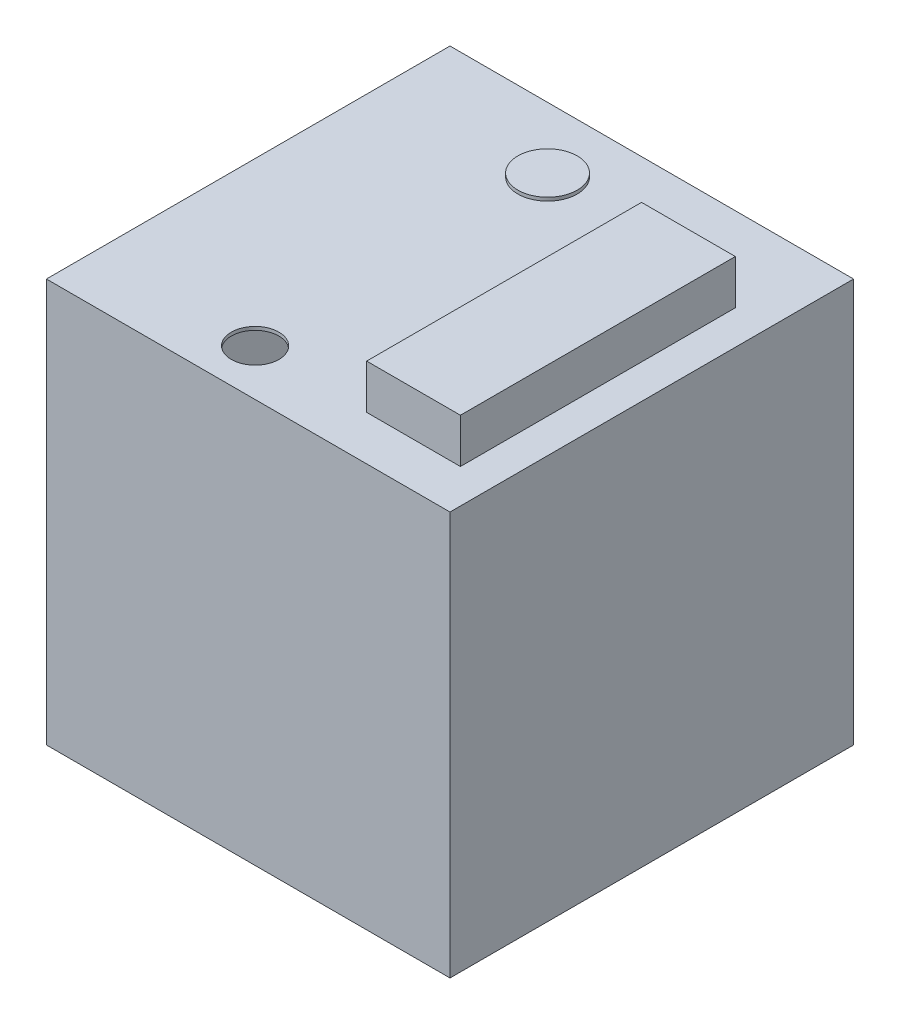
ISO-10303-21;
HEADER;
FILE_DESCRIPTION(('STEP AP214'),'2;1');
FILE_NAME('part.step','',(''),(''),'','','');
FILE_SCHEMA(('AUTOMOTIVE_DESIGN { 1 0 10303 214 1 1 1 1 }'));
ENDSEC;
DATA;
#1=APPLICATION_CONTEXT('core data for automotive mechanical design processes');
#2=APPLICATION_PROTOCOL_DEFINITION('international standard','automotive_design',2000,#1);
#3=PRODUCT_CONTEXT('',#1,'mechanical');
#4=PRODUCT('Part','Part','',(#3));
#5=PRODUCT_RELATED_PRODUCT_CATEGORY('part','',(#4));
#6=PRODUCT_DEFINITION_FORMATION('','',#4);
#7=PRODUCT_DEFINITION_CONTEXT('part definition',#1,'design');
#8=PRODUCT_DEFINITION('design','',#6,#7);
#9=PRODUCT_DEFINITION_SHAPE('','',#8);
#10=(LENGTH_UNIT() NAMED_UNIT(*) SI_UNIT(.MILLI.,.METRE.));
#11=(NAMED_UNIT(*) PLANE_ANGLE_UNIT() SI_UNIT($,.RADIAN.));
#12=(NAMED_UNIT(*) SI_UNIT($,.STERADIAN.) SOLID_ANGLE_UNIT());
#13=UNCERTAINTY_MEASURE_WITH_UNIT(LENGTH_MEASURE(1.E-05),#10,'distance_accuracy_value','');
#14=(GEOMETRIC_REPRESENTATION_CONTEXT(3) GLOBAL_UNCERTAINTY_ASSIGNED_CONTEXT((#13)) GLOBAL_UNIT_ASSIGNED_CONTEXT((#10,
#11,#12)) REPRESENTATION_CONTEXT('',''));
#15=CARTESIAN_POINT('',(0.,0.,0.));
#16=DIRECTION('',(0.,0.,1.));
#17=DIRECTION('',(1.,0.,0.));
#18=AXIS2_PLACEMENT_3D('',#15,#16,#17);
#19=CARTESIAN_POINT('',(0.,300.,0.));
#20=DIRECTION('',(0.,-1.,0.));
#21=DIRECTION('',(0.,0.,-1.));
#22=AXIS2_PLACEMENT_3D('',#19,#20,#21);
#23=PLANE('',#22);
#24=CARTESIAN_POINT('',(120.554438901877,300.,-251.957872919832));
#25=DIRECTION('',(0.,-1.,0.));
#26=DIRECTION('',(0.,0.,-1.));
#27=AXIS2_PLACEMENT_3D('',#24,#25,#26);
#28=CIRCLE('',#27,22.0629985297689);
#29=CARTESIAN_POINT('',(120.554438901877,300.,-274.0208714496));
#30=VERTEX_POINT('',#29);
#31=EDGE_CURVE('E54',#30,#30,#28,.F.);
#32=ORIENTED_EDGE('',*,*,#31,.F.);
#33=EDGE_LOOP('',(#32));
#34=FACE_BOUND('',#33,.T.);
#35=CARTESIAN_POINT('',(120.554438901877,300.,-34.5657529217078));
#36=DIRECTION('',(0.,1.,0.));
#37=DIRECTION('',(0.,0.,1.));
#38=AXIS2_PLACEMENT_3D('',#35,#36,#37);
#39=CIRCLE('',#38,17.6611169685422);
#40=CARTESIAN_POINT('',(120.554438901877,300.,-16.9046359531656));
#41=VERTEX_POINT('',#40);
#42=EDGE_CURVE('E260',#41,#41,#39,.T.);
#43=ORIENTED_EDGE('',*,*,#42,.F.);
#44=EDGE_LOOP('',(#43));
#45=FACE_BOUND('',#44,.T.);
#46=DIRECTION('',(0.,0.,1.));
#47=VECTOR('',#46,1.);
#48=CARTESIAN_POINT('',(0.,300.,0.));
#49=LINE('',#48,#47);
#50=CARTESIAN_POINT('',(0.,300.,-300.));
#51=VERTEX_POINT('',#50);
#52=CARTESIAN_POINT('',(0.,300.,0.));
#53=VERTEX_POINT('',#52);
#54=EDGE_CURVE('E309',#51,#53,#49,.T.);
#55=ORIENTED_EDGE('',*,*,#54,.T.);
#56=DIRECTION('',(1.,0.,0.));
#57=VECTOR('',#56,1.);
#58=CARTESIAN_POINT('',(0.,300.,0.));
#59=LINE('',#58,#57);
#60=CARTESIAN_POINT('',(300.,300.,0.));
#61=VERTEX_POINT('',#60);
#62=EDGE_CURVE('E312',#53,#61,#59,.T.);
#63=ORIENTED_EDGE('',*,*,#62,.T.);
#64=DIRECTION('',(0.,0.,-1.));
#65=VECTOR('',#64,1.);
#66=CARTESIAN_POINT('',(300.,300.,0.));
#67=LINE('',#66,#65);
#68=CARTESIAN_POINT('',(300.,300.,-300.));
#69=VERTEX_POINT('',#68);
#70=EDGE_CURVE('E315',#61,#69,#67,.T.);
#71=ORIENTED_EDGE('',*,*,#70,.T.);
#72=DIRECTION('',(-1.,0.,0.));
#73=VECTOR('',#72,1.);
#74=CARTESIAN_POINT('',(0.,300.,-300.));
#75=LINE('',#74,#73);
#76=EDGE_CURVE('E317',#69,#51,#75,.T.);
#77=ORIENTED_EDGE('',*,*,#76,.T.);
#78=EDGE_LOOP('',(#55,#63,#71,#77));
#79=FACE_BOUND('',#78,.T.);
#80=DIRECTION('',(0.,0.,1.));
#81=VECTOR('',#80,1.);
#82=CARTESIAN_POINT('',(204.884490094855,300.,-237.506276867464));
#83=LINE('',#82,#81);
#84=CARTESIAN_POINT('',(204.884490094855,300.,-237.506276867464));
#85=VERTEX_POINT('',#84);
#86=CARTESIAN_POINT('',(204.884490094855,300.,-33.1587645673039));
#87=VERTEX_POINT('',#86);
#88=EDGE_CURVE('E228',#85,#87,#83,.T.);
#89=ORIENTED_EDGE('',*,*,#88,.F.);
#90=DIRECTION('',(-1.,0.,0.));
#91=VECTOR('',#90,1.);
#92=CARTESIAN_POINT('',(204.884490094855,300.,-237.506276867464));
#93=LINE('',#92,#91);
#94=CARTESIAN_POINT('',(274.588614797324,300.,-237.506276867464));
#95=VERTEX_POINT('',#94);
#96=EDGE_CURVE('E166',#95,#85,#93,.T.);
#97=ORIENTED_EDGE('',*,*,#96,.F.);
#98=DIRECTION('',(0.,0.,-1.));
#99=VECTOR('',#98,1.);
#100=CARTESIAN_POINT('',(274.588614797324,300.,-237.506276867464));
#101=LINE('',#100,#99);
#102=CARTESIAN_POINT('',(274.588614797324,300.,-33.1587645673039));
#103=VERTEX_POINT('',#102);
#104=EDGE_CURVE('E66',#103,#95,#101,.T.);
#105=ORIENTED_EDGE('',*,*,#104,.F.);
#106=DIRECTION('',(1.,0.,0.));
#107=VECTOR('',#106,1.);
#108=CARTESIAN_POINT('',(204.884490094855,300.,-33.1587645673039));
#109=LINE('',#108,#107);
#110=EDGE_CURVE('E61',#87,#103,#109,.T.);
#111=ORIENTED_EDGE('',*,*,#110,.F.);
#112=EDGE_LOOP('',(#89,#97,#105,#111));
#113=FACE_BOUND('',#112,.T.);
#114=ADVANCED_FACE('F45',(#34,#45,#79,#113),#23,.F.);
#115=CARTESIAN_POINT('',(0.,2.54,0.));
#116=DIRECTION('',(0.,-1.,0.));
#117=DIRECTION('',(0.,0.,-1.));
#118=AXIS2_PLACEMENT_3D('',#115,#116,#117);
#119=PLANE('',#118);
#120=DIRECTION('',(0.,0.,1.));
#121=VECTOR('',#120,1.);
#122=CARTESIAN_POINT('',(2.54,2.54,0.));
#123=LINE('',#122,#121);
#124=CARTESIAN_POINT('',(2.54,2.54,-297.46));
#125=VERTEX_POINT('',#124);
#126=CARTESIAN_POINT('',(2.54,2.54,-2.54));
#127=VERTEX_POINT('',#126);
#128=EDGE_CURVE('E288',#125,#127,#123,.T.);
#129=ORIENTED_EDGE('',*,*,#128,.T.);
#130=DIRECTION('',(1.,0.,0.));
#131=VECTOR('',#130,1.);
#132=CARTESIAN_POINT('',(0.,2.54,-2.54));
#133=LINE('',#132,#131);
#134=CARTESIAN_POINT('',(297.46,2.54,-2.54));
#135=VERTEX_POINT('',#134);
#136=EDGE_CURVE('E291',#127,#135,#133,.T.);
#137=ORIENTED_EDGE('',*,*,#136,.T.);
#138=DIRECTION('',(0.,0.,-1.));
#139=VECTOR('',#138,1.);
#140=CARTESIAN_POINT('',(297.46,2.54,0.));
#141=LINE('',#140,#139);
#142=CARTESIAN_POINT('',(297.46,2.54,-297.46));
#143=VERTEX_POINT('',#142);
#144=EDGE_CURVE('E302',#135,#143,#141,.T.);
#145=ORIENTED_EDGE('',*,*,#144,.T.);
#146=DIRECTION('',(-1.,0.,0.));
#147=VECTOR('',#146,1.);
#148=CARTESIAN_POINT('',(0.,2.54,-297.46));
#149=LINE('',#148,#147);
#150=EDGE_CURVE('E299',#143,#125,#149,.T.);
#151=ORIENTED_EDGE('',*,*,#150,.T.);
#152=EDGE_LOOP('',(#129,#137,#145,#151));
#153=FACE_BOUND('',#152,.T.);
#154=ADVANCED_FACE('F346',(#153),#119,.F.);
#155=CARTESIAN_POINT('',(0.,300.,-297.46));
#156=DIRECTION('',(0.,0.,1.));
#157=DIRECTION('',(1.,0.,0.));
#158=AXIS2_PLACEMENT_3D('',#155,#156,#157);
#159=PLANE('',#158);
#160=DIRECTION('',(0.,-1.,0.));
#161=VECTOR('',#160,1.);
#162=CARTESIAN_POINT('',(297.46,300.,-297.46));
#163=LINE('',#162,#161);
#164=CARTESIAN_POINT('',(297.46,297.46,-297.46));
#165=VERTEX_POINT('',#164);
#166=EDGE_CURVE('E298',#165,#143,#163,.T.);
#167=ORIENTED_EDGE('',*,*,#166,.F.);
#168=DIRECTION('',(-1.,0.,0.));
#169=VECTOR('',#168,1.);
#170=CARTESIAN_POINT('',(0.,297.46,-297.46));
#171=LINE('',#170,#169);
#172=CARTESIAN_POINT('',(2.54,297.46,-297.46));
#173=VERTEX_POINT('',#172);
#174=EDGE_CURVE('E337',#165,#173,#171,.T.);
#175=ORIENTED_EDGE('',*,*,#174,.T.);
#176=DIRECTION('',(0.,-1.,0.));
#177=VECTOR('',#176,1.);
#178=CARTESIAN_POINT('',(2.54,300.,-297.46));
#179=LINE('',#178,#177);
#180=EDGE_CURVE('E296',#173,#125,#179,.T.);
#181=ORIENTED_EDGE('',*,*,#180,.T.);
#182=ORIENTED_EDGE('',*,*,#150,.F.);
#183=EDGE_LOOP('',(#167,#175,#181,#182));
#184=FACE_BOUND('',#183,.T.);
#185=ADVANCED_FACE('F426',(#184),#159,.T.);
#186=CARTESIAN_POINT('',(297.46,300.,0.));
#187=DIRECTION('',(-1.,0.,0.));
#188=DIRECTION('',(0.,0.,1.));
#189=AXIS2_PLACEMENT_3D('',#186,#187,#188);
#190=PLANE('',#189);
#191=DIRECTION('',(0.,-1.,0.));
#192=VECTOR('',#191,1.);
#193=CARTESIAN_POINT('',(297.46,300.,-2.54));
#194=LINE('',#193,#192);
#195=CARTESIAN_POINT('',(297.46,297.46,-2.54));
#196=VERTEX_POINT('',#195);
#197=EDGE_CURVE('E295',#196,#135,#194,.T.);
#198=ORIENTED_EDGE('',*,*,#197,.F.);
#199=DIRECTION('',(0.,0.,-1.));
#200=VECTOR('',#199,1.);
#201=CARTESIAN_POINT('',(297.46,297.46,0.));
#202=LINE('',#201,#200);
#203=EDGE_CURVE('E277',#196,#165,#202,.T.);
#204=ORIENTED_EDGE('',*,*,#203,.T.);
#205=ORIENTED_EDGE('',*,*,#166,.T.);
#206=ORIENTED_EDGE('',*,*,#144,.F.);
#207=EDGE_LOOP('',(#198,#204,#205,#206));
#208=FACE_BOUND('',#207,.T.);
#209=ADVANCED_FACE('F422',(#208),#190,.T.);
#210=CARTESIAN_POINT('',(0.,300.,-2.54));
#211=DIRECTION('',(0.,0.,-1.));
#212=DIRECTION('',(-1.,0.,0.));
#213=AXIS2_PLACEMENT_3D('',#210,#211,#212);
#214=PLANE('',#213);
#215=DIRECTION('',(0.,-1.,0.));
#216=VECTOR('',#215,1.);
#217=CARTESIAN_POINT('',(2.54,300.,-2.54));
#218=LINE('',#217,#216);
#219=CARTESIAN_POINT('',(2.54,297.46,-2.54));
#220=VERTEX_POINT('',#219);
#221=EDGE_CURVE('E292',#220,#127,#218,.T.);
#222=ORIENTED_EDGE('',*,*,#221,.F.);
#223=DIRECTION('',(1.,0.,0.));
#224=VECTOR('',#223,1.);
#225=CARTESIAN_POINT('',(0.,297.46,-2.54));
#226=LINE('',#225,#224);
#227=EDGE_CURVE('E282',#220,#196,#226,.T.);
#228=ORIENTED_EDGE('',*,*,#227,.T.);
#229=ORIENTED_EDGE('',*,*,#197,.T.);
#230=ORIENTED_EDGE('',*,*,#136,.F.);
#231=EDGE_LOOP('',(#222,#228,#229,#230));
#232=FACE_BOUND('',#231,.T.);
#233=ADVANCED_FACE('F418',(#232),#214,.T.);
#234=CARTESIAN_POINT('',(2.54,300.,0.));
#235=DIRECTION('',(1.,0.,0.));
#236=DIRECTION('',(0.,0.,-1.));
#237=AXIS2_PLACEMENT_3D('',#234,#235,#236);
#238=PLANE('',#237);
#239=ORIENTED_EDGE('',*,*,#180,.F.);
#240=DIRECTION('',(0.,0.,1.));
#241=VECTOR('',#240,1.);
#242=CARTESIAN_POINT('',(2.54,297.46,0.));
#243=LINE('',#242,#241);
#244=EDGE_CURVE('E285',#173,#220,#243,.T.);
#245=ORIENTED_EDGE('',*,*,#244,.T.);
#246=ORIENTED_EDGE('',*,*,#221,.T.);
#247=ORIENTED_EDGE('',*,*,#128,.F.);
#248=EDGE_LOOP('',(#239,#245,#246,#247));
#249=FACE_BOUND('',#248,.T.);
#250=ADVANCED_FACE('F414',(#249),#238,.T.);
#251=CARTESIAN_POINT('',(0.,297.46,0.));
#252=DIRECTION('',(0.,1.,0.));
#253=DIRECTION('',(0.,0.,1.));
#254=AXIS2_PLACEMENT_3D('',#251,#252,#253);
#255=PLANE('',#254);
#256=CARTESIAN_POINT('',(241.852973126811,297.46,-150.869372117143));
#257=DIRECTION('',(0.,1.,0.));
#258=DIRECTION('',(0.,0.,1.));
#259=AXIS2_PLACEMENT_3D('',#256,#257,#258);
#260=CIRCLE('',#259,19.013382907293);
#261=CARTESIAN_POINT('',(241.852973126811,297.46,-131.85598920985));
#262=VERTEX_POINT('',#261);
#263=EDGE_CURVE('E241',#262,#262,#260,.T.);
#264=ORIENTED_EDGE('',*,*,#263,.T.);
#265=EDGE_LOOP('',(#264));
#266=FACE_BOUND('',#265,.T.);
#267=CARTESIAN_POINT('',(120.554438901877,297.46,-34.5657529217078));
#268=DIRECTION('',(0.,1.,0.));
#269=DIRECTION('',(0.,0.,1.));
#270=AXIS2_PLACEMENT_3D('',#267,#268,#269);
#271=CIRCLE('',#270,17.6611169685422);
#272=CARTESIAN_POINT('',(120.554438901877,297.46,-16.9046359531656));
#273=VERTEX_POINT('',#272);
#274=EDGE_CURVE('E269',#273,#273,#271,.T.);
#275=ORIENTED_EDGE('',*,*,#274,.T.);
#276=EDGE_LOOP('',(#275));
#277=FACE_BOUND('',#276,.T.);
#278=CARTESIAN_POINT('',(120.554438901877,297.46,-251.957872919832));
#279=DIRECTION('',(0.,1.,0.));
#280=DIRECTION('',(0.,0.,1.));
#281=AXIS2_PLACEMENT_3D('',#278,#279,#280);
#282=CIRCLE('',#281,17.1918213135909);
#283=CARTESIAN_POINT('',(120.554438901877,297.46,-234.766051606241));
#284=VERTEX_POINT('',#283);
#285=EDGE_CURVE('E266',#284,#284,#282,.T.);
#286=ORIENTED_EDGE('',*,*,#285,.T.);
#287=EDGE_LOOP('',(#286));
#288=FACE_BOUND('',#287,.T.);
#289=CARTESIAN_POINT('',(241.557939960217,297.46,-206.697112562637));
#290=DIRECTION('',(0.,1.,0.));
#291=DIRECTION('',(0.,0.,1.));
#292=AXIS2_PLACEMENT_3D('',#289,#290,#291);
#293=CIRCLE('',#292,16.2019620569242);
#294=CARTESIAN_POINT('',(241.557939960217,297.46,-190.495150505713));
#295=VERTEX_POINT('',#294);
#296=EDGE_CURVE('E261',#295,#295,#293,.T.);
#297=ORIENTED_EDGE('',*,*,#296,.T.);
#298=EDGE_LOOP('',(#297));
#299=FACE_BOUND('',#298,.T.);
#300=CARTESIAN_POINT('',(241.557939960217,297.46,-57.9435686597378));
#301=DIRECTION('',(0.,1.,0.));
#302=DIRECTION('',(0.,0.,1.));
#303=AXIS2_PLACEMENT_3D('',#300,#301,#302);
#304=CIRCLE('',#303,15.8972712055889);
#305=CARTESIAN_POINT('',(241.557939960217,297.46,-42.0462974541489));
#306=VERTEX_POINT('',#305);
#307=EDGE_CURVE('E274',#306,#306,#304,.T.);
#308=ORIENTED_EDGE('',*,*,#307,.T.);
#309=EDGE_LOOP('',(#308));
#310=FACE_BOUND('',#309,.T.);
#311=ORIENTED_EDGE('',*,*,#244,.F.);
#312=ORIENTED_EDGE('',*,*,#174,.F.);
#313=ORIENTED_EDGE('',*,*,#203,.F.);
#314=ORIENTED_EDGE('',*,*,#227,.F.);
#315=EDGE_LOOP('',(#311,#312,#313,#314));
#316=FACE_BOUND('',#315,.T.);
#317=ADVANCED_FACE('F410',(#266,#277,#288,#299,#310,#316),#255,.F.);
#318=CARTESIAN_POINT('',(241.557939960217,297.46,-57.9435686597378));
#319=DIRECTION('',(0.,1.,0.));
#320=DIRECTION('',(0.,0.,1.));
#321=AXIS2_PLACEMENT_3D('',#318,#319,#320);
#322=CYLINDRICAL_SURFACE('',#321,15.8972712055889);
#323=ORIENTED_EDGE('',*,*,#307,.F.);
#324=EDGE_LOOP('',(#323));
#325=FACE_BOUND('',#324,.T.);
#326=CARTESIAN_POINT('',(241.557939960217,300.,-57.9435686597378));
#327=DIRECTION('',(0.,1.,0.));
#328=DIRECTION('',(0.,0.,1.));
#329=AXIS2_PLACEMENT_3D('',#326,#327,#328);
#330=CIRCLE('',#329,15.8972712055889);
#331=CARTESIAN_POINT('',(241.557939960217,300.,-42.0462974541489));
#332=VERTEX_POINT('',#331);
#333=EDGE_CURVE('E265',#332,#332,#330,.T.);
#334=ORIENTED_EDGE('',*,*,#333,.T.);
#335=EDGE_LOOP('',(#334));
#336=FACE_BOUND('',#335,.T.);
#337=ADVANCED_FACE('F399',(#325,#336),#322,.F.);
#338=CARTESIAN_POINT('',(241.557939960217,297.46,-206.697112562637));
#339=DIRECTION('',(0.,1.,0.));
#340=DIRECTION('',(0.,0.,1.));
#341=AXIS2_PLACEMENT_3D('',#338,#339,#340);
#342=CYLINDRICAL_SURFACE('',#341,16.2019620569242);
#343=ORIENTED_EDGE('',*,*,#296,.F.);
#344=EDGE_LOOP('',(#343));
#345=FACE_BOUND('',#344,.T.);
#346=CARTESIAN_POINT('',(241.557939960217,300.,-206.697112562637));
#347=DIRECTION('',(0.,1.,0.));
#348=DIRECTION('',(0.,0.,1.));
#349=AXIS2_PLACEMENT_3D('',#346,#347,#348);
#350=CIRCLE('',#349,16.2019620569242);
#351=CARTESIAN_POINT('',(241.557939960217,300.,-190.495150505713));
#352=VERTEX_POINT('',#351);
#353=EDGE_CURVE('E250',#352,#352,#350,.F.);
#354=ORIENTED_EDGE('',*,*,#353,.F.);
#355=EDGE_LOOP('',(#354));
#356=FACE_BOUND('',#355,.T.);
#357=ADVANCED_FACE('F395',(#345,#356),#342,.F.);
#358=CARTESIAN_POINT('',(120.554438901877,297.46,-251.957872919832));
#359=DIRECTION('',(0.,1.,0.));
#360=DIRECTION('',(0.,0.,1.));
#361=AXIS2_PLACEMENT_3D('',#358,#359,#360);
#362=CYLINDRICAL_SURFACE('',#361,17.1918213135909);
#363=ORIENTED_EDGE('',*,*,#285,.F.);
#364=EDGE_LOOP('',(#363));
#365=FACE_BOUND('',#364,.T.);
#366=CARTESIAN_POINT('',(120.554438901877,300.,-251.957872919832));
#367=DIRECTION('',(0.,1.,0.));
#368=DIRECTION('',(0.,0.,1.));
#369=AXIS2_PLACEMENT_3D('',#366,#367,#368);
#370=CIRCLE('',#369,17.1918213135909);
#371=CARTESIAN_POINT('',(120.554438901877,300.,-234.766051606241));
#372=VERTEX_POINT('',#371);
#373=EDGE_CURVE('E257',#372,#372,#370,.F.);
#374=ORIENTED_EDGE('',*,*,#373,.F.);
#375=EDGE_LOOP('',(#374));
#376=FACE_BOUND('',#375,.T.);
#377=ADVANCED_FACE('F398',(#365,#376),#362,.F.);
#378=CARTESIAN_POINT('',(120.554438901877,297.46,-34.5657529217078));
#379=DIRECTION('',(0.,1.,0.));
#380=DIRECTION('',(0.,0.,1.));
#381=AXIS2_PLACEMENT_3D('',#378,#379,#380);
#382=CYLINDRICAL_SURFACE('',#381,17.6611169685422);
#383=ORIENTED_EDGE('',*,*,#274,.F.);
#384=EDGE_LOOP('',(#383));
#385=FACE_BOUND('',#384,.T.);
#386=ORIENTED_EDGE('',*,*,#42,.T.);
#387=EDGE_LOOP('',(#386));
#388=FACE_BOUND('',#387,.T.);
#389=ADVANCED_FACE('F403',(#385,#388),#382,.F.);
#390=DIRECTION('',(1.,0.,0.));
#391=VECTOR('',#390,1.);
#392=CARTESIAN_POINT('',(269.743147729685,300.,-38.4081405799748));
#393=LINE('',#392,#391);
#394=CARTESIAN_POINT('',(209.277835101773,300.,-38.4081405799748));
#395=VERTEX_POINT('',#394);
#396=CARTESIAN_POINT('',(269.743147729685,300.,-38.4081405799748));
#397=VERTEX_POINT('',#396);
#398=EDGE_CURVE('E197',#395,#397,#393,.T.);
#399=ORIENTED_EDGE('',*,*,#398,.T.);
#400=DIRECTION('',(0.,0.,-1.));
#401=VECTOR('',#400,1.);
#402=CARTESIAN_POINT('',(269.743147729685,300.,-38.4081405799748));
#403=LINE('',#402,#401);
#404=CARTESIAN_POINT('',(269.743147729685,300.,-230.874289708481));
#405=VERTEX_POINT('',#404);
#406=EDGE_CURVE('E192',#397,#405,#403,.T.);
#407=ORIENTED_EDGE('',*,*,#406,.T.);
#408=DIRECTION('',(-1.,0.,0.));
#409=VECTOR('',#408,1.);
#410=CARTESIAN_POINT('',(269.743147729685,300.,-230.874289708481));
#411=LINE('',#410,#409);
#412=CARTESIAN_POINT('',(209.277835101773,300.,-230.874289708481));
#413=VERTEX_POINT('',#412);
#414=EDGE_CURVE('E210',#405,#413,#411,.T.);
#415=ORIENTED_EDGE('',*,*,#414,.T.);
#416=DIRECTION('',(0.,0.,1.));
#417=VECTOR('',#416,1.);
#418=CARTESIAN_POINT('',(209.277835101773,300.,-38.4081405799748));
#419=LINE('',#418,#417);
#420=EDGE_CURVE('E213',#413,#395,#419,.T.);
#421=ORIENTED_EDGE('',*,*,#420,.T.);
#422=EDGE_LOOP('',(#399,#407,#415,#421));
#423=FACE_BOUND('',#422,.T.);
#424=CARTESIAN_POINT('',(241.852973126811,300.,-150.869372117143));
#425=DIRECTION('',(0.,1.,0.));
#426=DIRECTION('',(0.,0.,1.));
#427=AXIS2_PLACEMENT_3D('',#424,#425,#426);
#428=CIRCLE('',#427,19.013382907293);
#429=CARTESIAN_POINT('',(241.852973126811,300.,-131.85598920985));
#430=VERTEX_POINT('',#429);
#431=EDGE_CURVE('E240',#430,#430,#428,.T.);
#432=ORIENTED_EDGE('',*,*,#431,.F.);
#433=EDGE_LOOP('',(#432));
#434=FACE_BOUND('',#433,.T.);
#435=CARTESIAN_POINT('',(241.557939960217,300.,-206.697112562637));
#436=DIRECTION('',(0.,-1.,0.));
#437=DIRECTION('',(0.,0.,-1.));
#438=AXIS2_PLACEMENT_3D('',#435,#436,#437);
#439=CIRCLE('',#438,19.9460754440356);
#440=CARTESIAN_POINT('',(241.557939960217,300.,-226.643188006672));
#441=VERTEX_POINT('',#440);
#442=EDGE_CURVE('E11',#441,#441,#439,.F.);
#443=ORIENTED_EDGE('',*,*,#442,.F.);
#444=EDGE_LOOP('',(#443));
#445=FACE_BOUND('',#444,.T.);
#446=ORIENTED_EDGE('',*,*,#333,.F.);
#447=EDGE_LOOP('',(#446));
#448=FACE_BOUND('',#447,.T.);
#449=ADVANCED_FACE('F348',(#423,#434,#445,#448),#23,.F.);
#450=CARTESIAN_POINT('',(0.,300.,0.));
#451=DIRECTION('',(1.,0.,0.));
#452=DIRECTION('',(0.,0.,-1.));
#453=AXIS2_PLACEMENT_3D('',#450,#451,#452);
#454=PLANE('',#453);
#455=DIRECTION('',(0.,-1.,0.));
#456=VECTOR('',#455,1.);
#457=CARTESIAN_POINT('',(0.,300.,-300.));
#458=LINE('',#457,#456);
#459=CARTESIAN_POINT('',(0.,0.,-300.));
#460=VERTEX_POINT('',#459);
#461=EDGE_CURVE('E319',#51,#460,#458,.T.);
#462=ORIENTED_EDGE('',*,*,#461,.T.);
#463=DIRECTION('',(0.,0.,1.));
#464=VECTOR('',#463,1.);
#465=CARTESIAN_POINT('',(0.,0.,0.));
#466=LINE('',#465,#464);
#467=CARTESIAN_POINT('',(0.,0.,0.));
#468=VERTEX_POINT('',#467);
#469=EDGE_CURVE('E294',#460,#468,#466,.T.);
#470=ORIENTED_EDGE('',*,*,#469,.T.);
#471=DIRECTION('',(0.,-1.,0.));
#472=VECTOR('',#471,1.);
#473=CARTESIAN_POINT('',(0.,300.,0.));
#474=LINE('',#473,#472);
#475=EDGE_CURVE('E335',#53,#468,#474,.T.);
#476=ORIENTED_EDGE('',*,*,#475,.F.);
#477=ORIENTED_EDGE('',*,*,#54,.F.);
#478=EDGE_LOOP('',(#462,#470,#476,#477));
#479=FACE_BOUND('',#478,.T.);
#480=ADVANCED_FACE('F47',(#479),#454,.F.);
#481=CARTESIAN_POINT('',(0.,300.,0.));
#482=DIRECTION('',(0.,0.,-1.));
#483=DIRECTION('',(-1.,0.,0.));
#484=AXIS2_PLACEMENT_3D('',#481,#482,#483);
#485=PLANE('',#484);
#486=ORIENTED_EDGE('',*,*,#475,.T.);
#487=DIRECTION('',(1.,0.,0.));
#488=VECTOR('',#487,1.);
#489=CARTESIAN_POINT('',(0.,0.,0.));
#490=LINE('',#489,#488);
#491=CARTESIAN_POINT('',(300.,0.,0.));
#492=VERTEX_POINT('',#491);
#493=EDGE_CURVE('E322',#468,#492,#490,.T.);
#494=ORIENTED_EDGE('',*,*,#493,.T.);
#495=DIRECTION('',(0.,-1.,0.));
#496=VECTOR('',#495,1.);
#497=CARTESIAN_POINT('',(300.,300.,0.));
#498=LINE('',#497,#496);
#499=EDGE_CURVE('E333',#61,#492,#498,.T.);
#500=ORIENTED_EDGE('',*,*,#499,.F.);
#501=ORIENTED_EDGE('',*,*,#62,.F.);
#502=EDGE_LOOP('',(#486,#494,#500,#501));
#503=FACE_BOUND('',#502,.T.);
#504=ADVANCED_FACE('F445',(#503),#485,.F.);
#505=CARTESIAN_POINT('',(300.,300.,0.));
#506=DIRECTION('',(-1.,0.,0.));
#507=DIRECTION('',(0.,0.,1.));
#508=AXIS2_PLACEMENT_3D('',#505,#506,#507);
#509=PLANE('',#508);
#510=ORIENTED_EDGE('',*,*,#499,.T.);
#511=DIRECTION('',(0.,0.,-1.));
#512=VECTOR('',#511,1.);
#513=CARTESIAN_POINT('',(300.,0.,0.));
#514=LINE('',#513,#512);
#515=CARTESIAN_POINT('',(300.,0.,-300.));
#516=VERTEX_POINT('',#515);
#517=EDGE_CURVE('E325',#492,#516,#514,.T.);
#518=ORIENTED_EDGE('',*,*,#517,.T.);
#519=DIRECTION('',(0.,-1.,0.));
#520=VECTOR('',#519,1.);
#521=CARTESIAN_POINT('',(300.,300.,-300.));
#522=LINE('',#521,#520);
#523=EDGE_CURVE('E331',#69,#516,#522,.T.);
#524=ORIENTED_EDGE('',*,*,#523,.F.);
#525=ORIENTED_EDGE('',*,*,#70,.F.);
#526=EDGE_LOOP('',(#510,#518,#524,#525));
#527=FACE_BOUND('',#526,.T.);
#528=ADVANCED_FACE('F442',(#527),#509,.F.);
#529=CARTESIAN_POINT('',(0.,300.,-300.));
#530=DIRECTION('',(0.,0.,1.));
#531=DIRECTION('',(1.,0.,0.));
#532=AXIS2_PLACEMENT_3D('',#529,#530,#531);
#533=PLANE('',#532);
#534=ORIENTED_EDGE('',*,*,#523,.T.);
#535=DIRECTION('',(-1.,0.,0.));
#536=VECTOR('',#535,1.);
#537=CARTESIAN_POINT('',(0.,0.,-300.));
#538=LINE('',#537,#536);
#539=EDGE_CURVE('E313',#516,#460,#538,.T.);
#540=ORIENTED_EDGE('',*,*,#539,.T.);
#541=ORIENTED_EDGE('',*,*,#461,.F.);
#542=ORIENTED_EDGE('',*,*,#76,.F.);
#543=EDGE_LOOP('',(#534,#540,#541,#542));
#544=FACE_BOUND('',#543,.T.);
#545=ADVANCED_FACE('F438',(#544),#533,.F.);
#546=CARTESIAN_POINT('',(0.,0.,0.));
#547=DIRECTION('',(0.,-1.,0.));
#548=DIRECTION('',(0.,0.,-1.));
#549=AXIS2_PLACEMENT_3D('',#546,#547,#548);
#550=PLANE('',#549);
#551=ORIENTED_EDGE('',*,*,#469,.F.);
#552=ORIENTED_EDGE('',*,*,#539,.F.);
#553=ORIENTED_EDGE('',*,*,#517,.F.);
#554=ORIENTED_EDGE('',*,*,#493,.F.);
#555=EDGE_LOOP('',(#551,#552,#553,#554));
#556=FACE_BOUND('',#555,.T.);
#557=ADVANCED_FACE('F387',(#556),#550,.T.);
#558=CARTESIAN_POINT('',(120.554438901877,302.54,-251.957872919832));
#559=DIRECTION('',(0.,1.,0.));
#560=DIRECTION('',(0.,0.,1.));
#561=AXIS2_PLACEMENT_3D('',#558,#559,#560);
#562=PLANE('',#561);
#563=CARTESIAN_POINT('',(120.554438901877,302.54,-251.957872919832));
#564=DIRECTION('',(0.,1.,0.));
#565=DIRECTION('',(0.,0.,1.));
#566=AXIS2_PLACEMENT_3D('',#563,#564,#565);
#567=CIRCLE('',#566,22.0629985297689);
#568=CARTESIAN_POINT('',(120.554438901877,302.54,-229.894874390063));
#569=VERTEX_POINT('',#568);
#570=EDGE_CURVE('E254',#569,#569,#567,.T.);
#571=ORIENTED_EDGE('',*,*,#570,.T.);
#572=EDGE_LOOP('',(#571));
#573=FACE_BOUND('',#572,.T.);
#574=ADVANCED_FACE('F384',(#573),#562,.T.);
#575=CARTESIAN_POINT('',(120.554438901877,302.54,-251.957872919832));
#576=DIRECTION('',(0.,-1.,0.));
#577=DIRECTION('',(0.,0.,-1.));
#578=AXIS2_PLACEMENT_3D('',#575,#576,#577);
#579=CYLINDRICAL_SURFACE('',#578,22.0629985297689);
#580=ORIENTED_EDGE('',*,*,#570,.F.);
#581=EDGE_LOOP('',(#580));
#582=FACE_BOUND('',#581,.T.);
#583=ORIENTED_EDGE('',*,*,#31,.T.);
#584=EDGE_LOOP('',(#583));
#585=FACE_BOUND('',#584,.T.);
#586=ADVANCED_FACE('F342',(#582,#585),#579,.T.);
#587=CARTESIAN_POINT('',(120.554438901877,300.,-251.957872919832));
#588=DIRECTION('',(0.,1.,0.));
#589=DIRECTION('',(0.,0.,1.));
#590=AXIS2_PLACEMENT_3D('',#587,#588,#589);
#591=PLANE('',#590);
#592=ORIENTED_EDGE('',*,*,#373,.T.);
#593=EDGE_LOOP('',(#592));
#594=FACE_BOUND('',#593,.T.);
#595=ADVANCED_FACE('F376',(#594),#591,.F.);
#596=CARTESIAN_POINT('',(241.557939960217,302.54,-206.697112562637));
#597=DIRECTION('',(0.,1.,0.));
#598=DIRECTION('',(0.,0.,1.));
#599=AXIS2_PLACEMENT_3D('',#596,#597,#598);
#600=PLANE('',#599);
#601=CARTESIAN_POINT('',(241.557939960217,302.54,-206.697112562637));
#602=DIRECTION('',(0.,1.,0.));
#603=DIRECTION('',(0.,0.,1.));
#604=AXIS2_PLACEMENT_3D('',#601,#602,#603);
#605=CIRCLE('',#604,19.9460754440356);
#606=CARTESIAN_POINT('',(241.557939960217,302.54,-186.751037118601));
#607=VERTEX_POINT('',#606);
#608=EDGE_CURVE('E244',#607,#607,#605,.T.);
#609=ORIENTED_EDGE('',*,*,#608,.T.);
#610=EDGE_LOOP('',(#609));
#611=FACE_BOUND('',#610,.T.);
#612=ADVANCED_FACE('F372',(#611),#600,.T.);
#613=CARTESIAN_POINT('',(241.557939960217,302.54,-206.697112562637));
#614=DIRECTION('',(0.,-1.,0.));
#615=DIRECTION('',(0.,0.,-1.));
#616=AXIS2_PLACEMENT_3D('',#613,#614,#615);
#617=CYLINDRICAL_SURFACE('',#616,19.9460754440356);
#618=ORIENTED_EDGE('',*,*,#608,.F.);
#619=EDGE_LOOP('',(#618));
#620=FACE_BOUND('',#619,.T.);
#621=ORIENTED_EDGE('',*,*,#442,.T.);
#622=EDGE_LOOP('',(#621));
#623=FACE_BOUND('',#622,.T.);
#624=ADVANCED_FACE('F375',(#620,#623),#617,.T.);
#625=CARTESIAN_POINT('',(241.557939960217,300.,-206.697112562637));
#626=DIRECTION('',(0.,1.,0.));
#627=DIRECTION('',(0.,0.,1.));
#628=AXIS2_PLACEMENT_3D('',#625,#626,#627);
#629=PLANE('',#628);
#630=ORIENTED_EDGE('',*,*,#353,.T.);
#631=EDGE_LOOP('',(#630));
#632=FACE_BOUND('',#631,.T.);
#633=ADVANCED_FACE('F370',(#632),#629,.F.);
#634=CARTESIAN_POINT('',(241.852973126811,297.46,-150.869372117143));
#635=DIRECTION('',(0.,1.,0.));
#636=DIRECTION('',(0.,0.,1.));
#637=AXIS2_PLACEMENT_3D('',#634,#635,#636);
#638=CYLINDRICAL_SURFACE('',#637,19.013382907293);
#639=ORIENTED_EDGE('',*,*,#263,.F.);
#640=EDGE_LOOP('',(#639));
#641=FACE_BOUND('',#640,.T.);
#642=ORIENTED_EDGE('',*,*,#431,.T.);
#643=EDGE_LOOP('',(#642));
#644=FACE_BOUND('',#643,.T.);
#645=ADVANCED_FACE('F364',(#641,#644),#638,.F.);
#646=CARTESIAN_POINT('',(204.884490094855,330.48,-237.506276867464));
#647=DIRECTION('',(1.,0.,0.));
#648=DIRECTION('',(0.,0.,-1.));
#649=AXIS2_PLACEMENT_3D('',#646,#647,#648);
#650=PLANE('',#649);
#651=ORIENTED_EDGE('',*,*,#88,.T.);
#652=DIRECTION('',(0.,-1.,0.));
#653=VECTOR('',#652,1.);
#654=CARTESIAN_POINT('',(204.884490094855,330.48,-33.1587645673039));
#655=LINE('',#654,#653);
#656=CARTESIAN_POINT('',(204.884490094855,333.02,-33.1587645673039));
#657=VERTEX_POINT('',#656);
#658=EDGE_CURVE('E174',#657,#87,#655,.T.);
#659=ORIENTED_EDGE('',*,*,#658,.F.);
#660=DIRECTION('',(0.,0.,1.));
#661=VECTOR('',#660,1.);
#662=CARTESIAN_POINT('',(204.884490094855,333.02,-237.506276867464));
#663=LINE('',#662,#661);
#664=CARTESIAN_POINT('',(204.884490094855,333.02,-237.506276867464));
#665=VERTEX_POINT('',#664);
#666=EDGE_CURVE('E172',#665,#657,#663,.T.);
#667=ORIENTED_EDGE('',*,*,#666,.F.);
#668=DIRECTION('',(0.,-1.,0.));
#669=VECTOR('',#668,1.);
#670=CARTESIAN_POINT('',(204.884490094855,330.48,-237.506276867464));
#671=LINE('',#670,#669);
#672=EDGE_CURVE('E160',#665,#85,#671,.T.);
#673=ORIENTED_EDGE('',*,*,#672,.T.);
#674=EDGE_LOOP('',(#651,#659,#667,#673));
#675=FACE_BOUND('',#674,.T.);
#676=ADVANCED_FACE('F173',(#675),#650,.F.);
#677=CARTESIAN_POINT('',(204.884490094855,330.48,-33.1587645673039));
#678=DIRECTION('',(0.,0.,-1.));
#679=DIRECTION('',(-1.,0.,0.));
#680=AXIS2_PLACEMENT_3D('',#677,#678,#679);
#681=PLANE('',#680);
#682=ORIENTED_EDGE('',*,*,#110,.T.);
#683=DIRECTION('',(0.,-1.,0.));
#684=VECTOR('',#683,1.);
#685=CARTESIAN_POINT('',(274.588614797324,330.48,-33.1587645673039));
#686=LINE('',#685,#684);
#687=CARTESIAN_POINT('',(274.588614797324,333.02,-33.1587645673039));
#688=VERTEX_POINT('',#687);
#689=EDGE_CURVE('E236',#688,#103,#686,.T.);
#690=ORIENTED_EDGE('',*,*,#689,.F.);
#691=DIRECTION('',(1.,0.,0.));
#692=VECTOR('',#691,1.);
#693=CARTESIAN_POINT('',(204.884490094855,333.02,-33.1587645673039));
#694=LINE('',#693,#692);
#695=EDGE_CURVE('E178',#657,#688,#694,.T.);
#696=ORIENTED_EDGE('',*,*,#695,.F.);
#697=ORIENTED_EDGE('',*,*,#658,.T.);
#698=EDGE_LOOP('',(#682,#690,#696,#697));
#699=FACE_BOUND('',#698,.T.);
#700=ADVANCED_FACE('F356',(#699),#681,.F.);
#701=CARTESIAN_POINT('',(274.588614797324,330.48,-237.506276867464));
#702=DIRECTION('',(-1.,0.,0.));
#703=DIRECTION('',(0.,0.,1.));
#704=AXIS2_PLACEMENT_3D('',#701,#702,#703);
#705=PLANE('',#704);
#706=ORIENTED_EDGE('',*,*,#104,.T.);
#707=DIRECTION('',(0.,-1.,0.));
#708=VECTOR('',#707,1.);
#709=CARTESIAN_POINT('',(274.588614797324,330.48,-237.506276867464));
#710=LINE('',#709,#708);
#711=CARTESIAN_POINT('',(274.588614797324,333.02,-237.506276867464));
#712=VERTEX_POINT('',#711);
#713=EDGE_CURVE('E169',#712,#95,#710,.T.);
#714=ORIENTED_EDGE('',*,*,#713,.F.);
#715=DIRECTION('',(0.,0.,-1.));
#716=VECTOR('',#715,1.);
#717=CARTESIAN_POINT('',(274.588614797324,333.02,-33.1587645673039));
#718=LINE('',#717,#716);
#719=EDGE_CURVE('E183',#688,#712,#718,.T.);
#720=ORIENTED_EDGE('',*,*,#719,.F.);
#721=ORIENTED_EDGE('',*,*,#689,.T.);
#722=EDGE_LOOP('',(#706,#714,#720,#721));
#723=FACE_BOUND('',#722,.T.);
#724=ADVANCED_FACE('F354',(#723),#705,.F.);
#725=CARTESIAN_POINT('',(204.884490094855,330.48,-237.506276867464));
#726=DIRECTION('',(0.,0.,1.));
#727=DIRECTION('',(1.,0.,0.));
#728=AXIS2_PLACEMENT_3D('',#725,#726,#727);
#729=PLANE('',#728);
#730=ORIENTED_EDGE('',*,*,#96,.T.);
#731=ORIENTED_EDGE('',*,*,#672,.F.);
#732=DIRECTION('',(-1.,0.,0.));
#733=VECTOR('',#732,1.);
#734=CARTESIAN_POINT('',(274.588614797324,333.02,-237.506276867464));
#735=LINE('',#734,#733);
#736=EDGE_CURVE('E165',#712,#665,#735,.T.);
#737=ORIENTED_EDGE('',*,*,#736,.F.);
#738=ORIENTED_EDGE('',*,*,#713,.T.);
#739=EDGE_LOOP('',(#730,#731,#737,#738));
#740=FACE_BOUND('',#739,.T.);
#741=ADVANCED_FACE('F162',(#740),#729,.F.);
#742=CARTESIAN_POINT('',(269.743147729685,330.48,-38.4081405799748));
#743=DIRECTION('',(-1.,0.,0.));
#744=DIRECTION('',(0.,0.,1.));
#745=AXIS2_PLACEMENT_3D('',#742,#743,#744);
#746=PLANE('',#745);
#747=ORIENTED_EDGE('',*,*,#406,.F.);
#748=DIRECTION('',(0.,-1.,0.));
#749=VECTOR('',#748,1.);
#750=CARTESIAN_POINT('',(269.743147729685,330.48,-38.4081405799748));
#751=LINE('',#750,#749);
#752=CARTESIAN_POINT('',(269.743147729685,330.48,-38.4081405799748));
#753=VERTEX_POINT('',#752);
#754=EDGE_CURVE('E207',#753,#397,#751,.T.);
#755=ORIENTED_EDGE('',*,*,#754,.F.);
#756=DIRECTION('',(0.,0.,-1.));
#757=VECTOR('',#756,1.);
#758=CARTESIAN_POINT('',(269.743147729685,330.48,-38.4081405799748));
#759=LINE('',#758,#757);
#760=CARTESIAN_POINT('',(269.743147729685,330.48,-230.874289708481));
#761=VERTEX_POINT('',#760);
#762=EDGE_CURVE('E193',#753,#761,#759,.T.);
#763=ORIENTED_EDGE('',*,*,#762,.T.);
#764=DIRECTION('',(0.,-1.,0.));
#765=VECTOR('',#764,1.);
#766=CARTESIAN_POINT('',(269.743147729685,330.48,-230.874289708481));
#767=LINE('',#766,#765);
#768=EDGE_CURVE('E224',#761,#405,#767,.T.);
#769=ORIENTED_EDGE('',*,*,#768,.T.);
#770=EDGE_LOOP('',(#747,#755,#763,#769));
#771=FACE_BOUND('',#770,.T.);
#772=ADVANCED_FACE('F563',(#771),#746,.T.);
#773=CARTESIAN_POINT('',(269.743147729685,330.48,-230.874289708481));
#774=DIRECTION('',(0.,0.,1.));
#775=DIRECTION('',(1.,0.,0.));
#776=AXIS2_PLACEMENT_3D('',#773,#774,#775);
#777=PLANE('',#776);
#778=ORIENTED_EDGE('',*,*,#414,.F.);
#779=ORIENTED_EDGE('',*,*,#768,.F.);
#780=DIRECTION('',(-1.,0.,0.));
#781=VECTOR('',#780,1.);
#782=CARTESIAN_POINT('',(269.743147729685,330.48,-230.874289708481));
#783=LINE('',#782,#781);
#784=CARTESIAN_POINT('',(209.277835101773,330.48,-230.874289708481));
#785=VERTEX_POINT('',#784);
#786=EDGE_CURVE('E196',#761,#785,#783,.T.);
#787=ORIENTED_EDGE('',*,*,#786,.T.);
#788=DIRECTION('',(0.,-1.,0.));
#789=VECTOR('',#788,1.);
#790=CARTESIAN_POINT('',(209.277835101773,330.48,-230.874289708481));
#791=LINE('',#790,#789);
#792=EDGE_CURVE('E222',#785,#413,#791,.T.);
#793=ORIENTED_EDGE('',*,*,#792,.T.);
#794=EDGE_LOOP('',(#778,#779,#787,#793));
#795=FACE_BOUND('',#794,.T.);
#796=ADVANCED_FACE('F527',(#795),#777,.T.);
#797=CARTESIAN_POINT('',(209.277835101773,330.48,-38.4081405799748));
#798=DIRECTION('',(1.,0.,0.));
#799=DIRECTION('',(0.,0.,-1.));
#800=AXIS2_PLACEMENT_3D('',#797,#798,#799);
#801=PLANE('',#800);
#802=ORIENTED_EDGE('',*,*,#420,.F.);
#803=ORIENTED_EDGE('',*,*,#792,.F.);
#804=DIRECTION('',(0.,0.,1.));
#805=VECTOR('',#804,1.);
#806=CARTESIAN_POINT('',(209.277835101773,330.48,-38.4081405799748));
#807=LINE('',#806,#805);
#808=CARTESIAN_POINT('',(209.277835101773,330.48,-38.4081405799748));
#809=VERTEX_POINT('',#808);
#810=EDGE_CURVE('E201',#785,#809,#807,.T.);
#811=ORIENTED_EDGE('',*,*,#810,.T.);
#812=DIRECTION('',(0.,-1.,0.));
#813=VECTOR('',#812,1.);
#814=CARTESIAN_POINT('',(209.277835101773,330.48,-38.4081405799748));
#815=LINE('',#814,#813);
#816=EDGE_CURVE('E220',#809,#395,#815,.T.);
#817=ORIENTED_EDGE('',*,*,#816,.T.);
#818=EDGE_LOOP('',(#802,#803,#811,#817));
#819=FACE_BOUND('',#818,.T.);
#820=ADVANCED_FACE('F522',(#819),#801,.T.);
#821=CARTESIAN_POINT('',(269.743147729685,330.48,-38.4081405799748));
#822=DIRECTION('',(0.,0.,-1.));
#823=DIRECTION('',(-1.,0.,0.));
#824=AXIS2_PLACEMENT_3D('',#821,#822,#823);
#825=PLANE('',#824);
#826=ORIENTED_EDGE('',*,*,#398,.F.);
#827=ORIENTED_EDGE('',*,*,#816,.F.);
#828=DIRECTION('',(1.,0.,0.));
#829=VECTOR('',#828,1.);
#830=CARTESIAN_POINT('',(269.743147729685,330.48,-38.4081405799748));
#831=LINE('',#830,#829);
#832=EDGE_CURVE('E204',#809,#753,#831,.T.);
#833=ORIENTED_EDGE('',*,*,#832,.T.);
#834=ORIENTED_EDGE('',*,*,#754,.T.);
#835=EDGE_LOOP('',(#826,#827,#833,#834));
#836=FACE_BOUND('',#835,.T.);
#837=ADVANCED_FACE('F526',(#836),#825,.T.);
#838=CARTESIAN_POINT('',(0.,330.48,0.));
#839=DIRECTION('',(0.,1.,0.));
#840=DIRECTION('',(0.,0.,1.));
#841=AXIS2_PLACEMENT_3D('',#838,#839,#840);
#842=PLANE('',#841);
#843=ORIENTED_EDGE('',*,*,#786,.F.);
#844=ORIENTED_EDGE('',*,*,#762,.F.);
#845=ORIENTED_EDGE('',*,*,#832,.F.);
#846=ORIENTED_EDGE('',*,*,#810,.F.);
#847=EDGE_LOOP('',(#843,#844,#845,#846));
#848=FACE_BOUND('',#847,.T.);
#849=ADVANCED_FACE('F537',(#848),#842,.F.);
#850=CARTESIAN_POINT('',(0.,333.02,0.));
#851=DIRECTION('',(0.,1.,0.));
#852=DIRECTION('',(0.,0.,1.));
#853=AXIS2_PLACEMENT_3D('',#850,#851,#852);
#854=PLANE('',#853);
#855=ORIENTED_EDGE('',*,*,#736,.T.);
#856=ORIENTED_EDGE('',*,*,#666,.T.);
#857=ORIENTED_EDGE('',*,*,#695,.T.);
#858=ORIENTED_EDGE('',*,*,#719,.T.);
#859=EDGE_LOOP('',(#855,#856,#857,#858));
#860=FACE_BOUND('',#859,.T.);
#861=ADVANCED_FACE('F181',(#860),#854,.T.);
#862=CLOSED_SHELL('',(#114,#154,#185,#209,#233,#250,#317,#337,#357,#377,#389,#449,#480,#504,
#528,#545,#557,#574,#586,#595,#612,#624,#633,#645,#676,#700,#724,#741,#772,#796,#820,#837,#849,#861));
#863=MANIFOLD_SOLID_BREP('B2',#862);
#864=ADVANCED_BREP_SHAPE_REPRESENTATION('',(#18,#863),#14);
#865=SHAPE_DEFINITION_REPRESENTATION(#9,#864);
ENDSEC;
END-ISO-10303-21;
